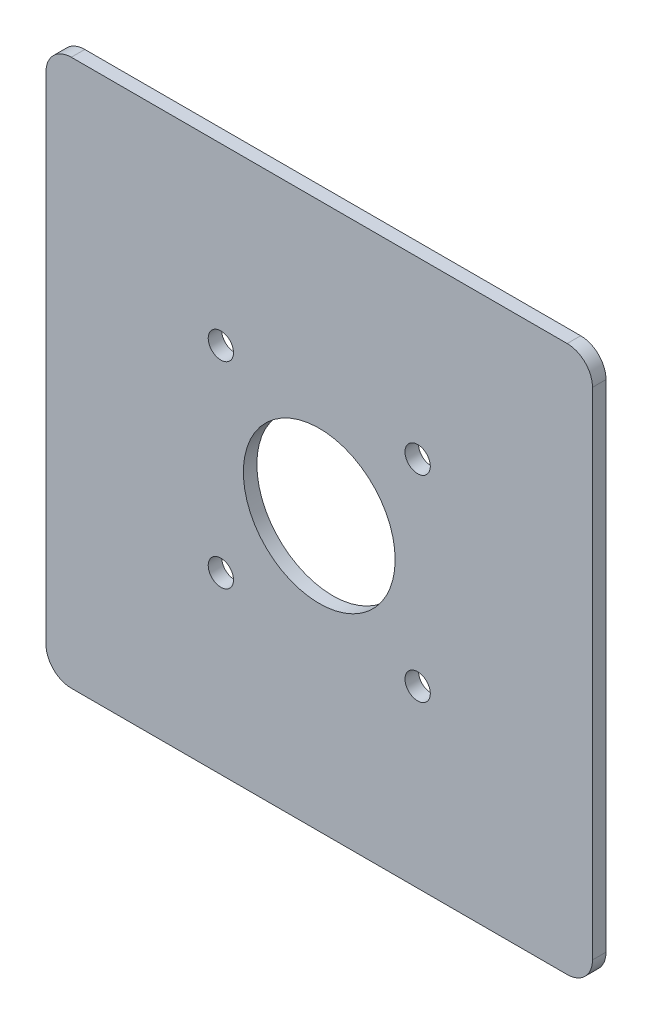
ISO-10303-21;
HEADER;
FILE_DESCRIPTION(('STEP AP214'),'2;1');
FILE_NAME('part.step','',(''),(''),'','','');
FILE_SCHEMA(('AUTOMOTIVE_DESIGN { 1 0 10303 214 1 1 1 1 }'));
ENDSEC;
DATA;
#1=APPLICATION_CONTEXT('core data for automotive mechanical design processes');
#2=APPLICATION_PROTOCOL_DEFINITION('international standard','automotive_design',2000,#1);
#3=PRODUCT_CONTEXT('',#1,'mechanical');
#4=PRODUCT('Part','Part','',(#3));
#5=PRODUCT_RELATED_PRODUCT_CATEGORY('part','',(#4));
#6=PRODUCT_DEFINITION_FORMATION('','',#4);
#7=PRODUCT_DEFINITION_CONTEXT('part definition',#1,'design');
#8=PRODUCT_DEFINITION('design','',#6,#7);
#9=PRODUCT_DEFINITION_SHAPE('','',#8);
#10=(LENGTH_UNIT() NAMED_UNIT(*) SI_UNIT(.MILLI.,.METRE.));
#11=(NAMED_UNIT(*) PLANE_ANGLE_UNIT() SI_UNIT($,.RADIAN.));
#12=(NAMED_UNIT(*) SI_UNIT($,.STERADIAN.) SOLID_ANGLE_UNIT());
#13=UNCERTAINTY_MEASURE_WITH_UNIT(LENGTH_MEASURE(1.E-05),#10,'distance_accuracy_value','');
#14=(GEOMETRIC_REPRESENTATION_CONTEXT(3) GLOBAL_UNCERTAINTY_ASSIGNED_CONTEXT((#13)) GLOBAL_UNIT_ASSIGNED_CONTEXT((#10,
#11,#12)) REPRESENTATION_CONTEXT('',''));
#15=CARTESIAN_POINT('',(0.,0.,0.));
#16=DIRECTION('',(0.,0.,1.));
#17=DIRECTION('',(1.,0.,0.));
#18=AXIS2_PLACEMENT_3D('',#15,#16,#17);
#19=CARTESIAN_POINT('',(162.,-162.,8.));
#20=DIRECTION('',(-1.,0.,0.));
#21=DIRECTION('',(0.,0.,1.));
#22=AXIS2_PLACEMENT_3D('',#19,#20,#21);
#23=PLANE('',#22);
#24=DIRECTION('',(0.,1.,0.));
#25=VECTOR('',#24,1.);
#26=CARTESIAN_POINT('',(162.,-162.,0.));
#27=LINE('',#26,#25);
#28=CARTESIAN_POINT('',(162.,-147.,0.));
#29=VERTEX_POINT('',#28);
#30=CARTESIAN_POINT('',(162.,147.,0.));
#31=VERTEX_POINT('',#30);
#32=EDGE_CURVE('E126',#29,#31,#27,.T.);
#33=ORIENTED_EDGE('',*,*,#32,.T.);
#34=DIRECTION('',(0.,0.,-1.));
#35=VECTOR('',#34,1.);
#36=CARTESIAN_POINT('',(162.,147.,8.));
#37=LINE('',#36,#35);
#38=CARTESIAN_POINT('',(162.,147.,8.));
#39=VERTEX_POINT('',#38);
#40=EDGE_CURVE('E104',#31,#39,#37,.F.);
#41=ORIENTED_EDGE('',*,*,#40,.T.);
#42=DIRECTION('',(0.,1.,0.));
#43=VECTOR('',#42,1.);
#44=CARTESIAN_POINT('',(162.,-162.,8.));
#45=LINE('',#44,#43);
#46=CARTESIAN_POINT('',(162.,-147.,8.));
#47=VERTEX_POINT('',#46);
#48=EDGE_CURVE('E136',#47,#39,#45,.T.);
#49=ORIENTED_EDGE('',*,*,#48,.F.);
#50=DIRECTION('',(0.,0.,-1.));
#51=VECTOR('',#50,1.);
#52=CARTESIAN_POINT('',(162.,-147.,8.));
#53=LINE('',#52,#51);
#54=EDGE_CURVE('E109',#47,#29,#53,.T.);
#55=ORIENTED_EDGE('',*,*,#54,.T.);
#56=EDGE_LOOP('',(#33,#41,#49,#55));
#57=FACE_BOUND('',#56,.T.);
#58=ADVANCED_FACE('F33',(#57),#23,.F.);
#59=CARTESIAN_POINT('',(-162.,162.,8.));
#60=DIRECTION('',(0.,-1.,0.));
#61=DIRECTION('',(0.,0.,-1.));
#62=AXIS2_PLACEMENT_3D('',#59,#60,#61);
#63=PLANE('',#62);
#64=DIRECTION('',(-1.,0.,0.));
#65=VECTOR('',#64,1.);
#66=CARTESIAN_POINT('',(-162.,162.,8.));
#67=LINE('',#66,#65);
#68=CARTESIAN_POINT('',(147.,162.,8.));
#69=VERTEX_POINT('',#68);
#70=CARTESIAN_POINT('',(-147.,162.,8.));
#71=VERTEX_POINT('',#70);
#72=EDGE_CURVE('E119',#69,#71,#67,.T.);
#73=ORIENTED_EDGE('',*,*,#72,.F.);
#74=DIRECTION('',(0.,0.,-1.));
#75=VECTOR('',#74,1.);
#76=CARTESIAN_POINT('',(147.,162.,8.));
#77=LINE('',#76,#75);
#78=CARTESIAN_POINT('',(147.,162.,0.));
#79=VERTEX_POINT('',#78);
#80=EDGE_CURVE('E103',#69,#79,#77,.T.);
#81=ORIENTED_EDGE('',*,*,#80,.T.);
#82=DIRECTION('',(-1.,0.,0.));
#83=VECTOR('',#82,1.);
#84=CARTESIAN_POINT('',(-162.,162.,0.));
#85=LINE('',#84,#83);
#86=CARTESIAN_POINT('',(-147.,162.,0.));
#87=VERTEX_POINT('',#86);
#88=EDGE_CURVE('E116',#79,#87,#85,.T.);
#89=ORIENTED_EDGE('',*,*,#88,.T.);
#90=DIRECTION('',(0.,0.,-1.));
#91=VECTOR('',#90,1.);
#92=CARTESIAN_POINT('',(-147.,162.,8.));
#93=LINE('',#92,#91);
#94=EDGE_CURVE('E121',#87,#71,#93,.F.);
#95=ORIENTED_EDGE('',*,*,#94,.T.);
#96=EDGE_LOOP('',(#73,#81,#89,#95));
#97=FACE_BOUND('',#96,.T.);
#98=ADVANCED_FACE('F115',(#97),#63,.F.);
#99=CARTESIAN_POINT('',(-162.,-162.,8.));
#100=DIRECTION('',(1.,0.,0.));
#101=DIRECTION('',(0.,0.,-1.));
#102=AXIS2_PLACEMENT_3D('',#99,#100,#101);
#103=PLANE('',#102);
#104=DIRECTION('',(0.,-1.,0.));
#105=VECTOR('',#104,1.);
#106=CARTESIAN_POINT('',(-162.,-162.,8.));
#107=LINE('',#106,#105);
#108=CARTESIAN_POINT('',(-162.,147.,8.));
#109=VERTEX_POINT('',#108);
#110=CARTESIAN_POINT('',(-162.,-147.,8.));
#111=VERTEX_POINT('',#110);
#112=EDGE_CURVE('E167',#109,#111,#107,.T.);
#113=ORIENTED_EDGE('',*,*,#112,.F.);
#114=DIRECTION('',(0.,0.,-1.));
#115=VECTOR('',#114,1.);
#116=CARTESIAN_POINT('',(-162.,147.,8.));
#117=LINE('',#116,#115);
#118=CARTESIAN_POINT('',(-162.,147.,0.));
#119=VERTEX_POINT('',#118);
#120=EDGE_CURVE('E160',#109,#119,#117,.T.);
#121=ORIENTED_EDGE('',*,*,#120,.T.);
#122=DIRECTION('',(0.,-1.,0.));
#123=VECTOR('',#122,1.);
#124=CARTESIAN_POINT('',(-162.,-162.,0.));
#125=LINE('',#124,#123);
#126=CARTESIAN_POINT('',(-162.,-147.,0.));
#127=VERTEX_POINT('',#126);
#128=EDGE_CURVE('E125',#119,#127,#125,.T.);
#129=ORIENTED_EDGE('',*,*,#128,.T.);
#130=DIRECTION('',(0.,0.,-1.));
#131=VECTOR('',#130,1.);
#132=CARTESIAN_POINT('',(-162.,-147.,8.));
#133=LINE('',#132,#131);
#134=EDGE_CURVE('E158',#127,#111,#133,.F.);
#135=ORIENTED_EDGE('',*,*,#134,.T.);
#136=EDGE_LOOP('',(#113,#121,#129,#135));
#137=FACE_BOUND('',#136,.T.);
#138=ADVANCED_FACE('F165',(#137),#103,.F.);
#139=CARTESIAN_POINT('',(-162.,-162.,8.));
#140=DIRECTION('',(0.,1.,0.));
#141=DIRECTION('',(0.,0.,1.));
#142=AXIS2_PLACEMENT_3D('',#139,#140,#141);
#143=PLANE('',#142);
#144=DIRECTION('',(1.,0.,0.));
#145=VECTOR('',#144,1.);
#146=CARTESIAN_POINT('',(-162.,-162.,8.));
#147=LINE('',#146,#145);
#148=CARTESIAN_POINT('',(-147.,-162.,8.));
#149=VERTEX_POINT('',#148);
#150=CARTESIAN_POINT('',(147.,-162.,8.));
#151=VERTEX_POINT('',#150);
#152=EDGE_CURVE('E142',#149,#151,#147,.T.);
#153=ORIENTED_EDGE('',*,*,#152,.F.);
#154=DIRECTION('',(0.,0.,-1.));
#155=VECTOR('',#154,1.);
#156=CARTESIAN_POINT('',(-147.,-162.,8.));
#157=LINE('',#156,#155);
#158=CARTESIAN_POINT('',(-147.,-162.,0.));
#159=VERTEX_POINT('',#158);
#160=EDGE_CURVE('E11',#149,#159,#157,.T.);
#161=ORIENTED_EDGE('',*,*,#160,.T.);
#162=DIRECTION('',(1.,0.,0.));
#163=VECTOR('',#162,1.);
#164=CARTESIAN_POINT('',(-162.,-162.,0.));
#165=LINE('',#164,#163);
#166=CARTESIAN_POINT('',(147.,-162.,0.));
#167=VERTEX_POINT('',#166);
#168=EDGE_CURVE('E129',#159,#167,#165,.T.);
#169=ORIENTED_EDGE('',*,*,#168,.T.);
#170=DIRECTION('',(0.,0.,-1.));
#171=VECTOR('',#170,1.);
#172=CARTESIAN_POINT('',(147.,-162.,8.));
#173=LINE('',#172,#171);
#174=EDGE_CURVE('E41',#167,#151,#173,.F.);
#175=ORIENTED_EDGE('',*,*,#174,.T.);
#176=EDGE_LOOP('',(#153,#161,#169,#175));
#177=FACE_BOUND('',#176,.T.);
#178=ADVANCED_FACE('F174',(#177),#143,.F.);
#179=CARTESIAN_POINT('',(0.,0.,8.));
#180=DIRECTION('',(0.,0.,-1.));
#181=DIRECTION('',(-1.,0.,0.));
#182=AXIS2_PLACEMENT_3D('',#179,#180,#181);
#183=PLANE('',#182);
#184=CARTESIAN_POINT('',(-58.3363094478904,58.33630944789,8.));
#185=DIRECTION('',(0.,0.,1.));
#186=DIRECTION('',(0.,1.,0.));
#187=AXIS2_PLACEMENT_3D('',#184,#185,#186);
#188=CIRCLE('',#187,7.5);
#189=CARTESIAN_POINT('',(-58.3363094478904,65.83630944789,8.));
#190=VERTEX_POINT('',#189);
#191=EDGE_CURVE('E200',#190,#190,#188,.T.);
#192=ORIENTED_EDGE('',*,*,#191,.F.);
#193=EDGE_LOOP('',(#192));
#194=FACE_BOUND('',#193,.T.);
#195=CARTESIAN_POINT('',(-58.3363094478902,-58.3363094478902,8.));
#196=DIRECTION('',(0.,0.,1.));
#197=DIRECTION('',(-1.,0.,0.));
#198=AXIS2_PLACEMENT_3D('',#195,#196,#197);
#199=CIRCLE('',#198,7.5);
#200=CARTESIAN_POINT('',(-65.8363094478901,-58.3363094478902,8.));
#201=VERTEX_POINT('',#200);
#202=EDGE_CURVE('E194',#201,#201,#199,.T.);
#203=ORIENTED_EDGE('',*,*,#202,.F.);
#204=EDGE_LOOP('',(#203));
#205=FACE_BOUND('',#204,.T.);
#206=CARTESIAN_POINT('',(58.3363094478908,-58.3363094478895,8.));
#207=DIRECTION('',(0.,0.,1.));
#208=DIRECTION('',(0.,-1.,0.));
#209=AXIS2_PLACEMENT_3D('',#206,#207,#208);
#210=CIRCLE('',#209,7.5);
#211=CARTESIAN_POINT('',(58.3363094478909,-65.8363094478895,8.));
#212=VERTEX_POINT('',#211);
#213=EDGE_CURVE('E188',#212,#212,#210,.T.);
#214=ORIENTED_EDGE('',*,*,#213,.F.);
#215=EDGE_LOOP('',(#214));
#216=FACE_BOUND('',#215,.T.);
#217=CARTESIAN_POINT('',(0.,0.,8.));
#218=DIRECTION('',(0.,0.,1.));
#219=DIRECTION('',(1.,0.,0.));
#220=AXIS2_PLACEMENT_3D('',#217,#218,#219);
#221=CIRCLE('',#220,45.);
#222=CARTESIAN_POINT('',(45.,0.,8.));
#223=VERTEX_POINT('',#222);
#224=EDGE_CURVE('E141',#223,#223,#221,.T.);
#225=ORIENTED_EDGE('',*,*,#224,.F.);
#226=EDGE_LOOP('',(#225));
#227=FACE_BOUND('',#226,.T.);
#228=CARTESIAN_POINT('',(58.3363094478902,58.3363094478902,8.));
#229=DIRECTION('',(0.,0.,1.));
#230=DIRECTION('',(1.,0.,0.));
#231=AXIS2_PLACEMENT_3D('',#228,#229,#230);
#232=CIRCLE('',#231,7.5);
#233=CARTESIAN_POINT('',(65.8363094478901,58.3363094478902,8.));
#234=VERTEX_POINT('',#233);
#235=EDGE_CURVE('E140',#234,#234,#232,.T.);
#236=ORIENTED_EDGE('',*,*,#235,.F.);
#237=EDGE_LOOP('',(#236));
#238=FACE_BOUND('',#237,.T.);
#239=ORIENTED_EDGE('',*,*,#48,.T.);
#240=CARTESIAN_POINT('',(147.,147.,8.));
#241=DIRECTION('',(0.,0.,-1.));
#242=DIRECTION('',(-1.,0.,0.));
#243=AXIS2_PLACEMENT_3D('',#240,#241,#242);
#244=CIRCLE('',#243,15.);
#245=EDGE_CURVE('E156',#39,#69,#244,.F.);
#246=ORIENTED_EDGE('',*,*,#245,.T.);
#247=ORIENTED_EDGE('',*,*,#72,.T.);
#248=CARTESIAN_POINT('',(-147.,147.,8.));
#249=DIRECTION('',(0.,0.,-1.));
#250=DIRECTION('',(-1.,0.,0.));
#251=AXIS2_PLACEMENT_3D('',#248,#249,#250);
#252=CIRCLE('',#251,15.);
#253=EDGE_CURVE('E154',#71,#109,#252,.F.);
#254=ORIENTED_EDGE('',*,*,#253,.T.);
#255=ORIENTED_EDGE('',*,*,#112,.T.);
#256=CARTESIAN_POINT('',(-147.,-147.,8.));
#257=DIRECTION('',(0.,0.,-1.));
#258=DIRECTION('',(-1.,0.,0.));
#259=AXIS2_PLACEMENT_3D('',#256,#257,#258);
#260=CIRCLE('',#259,15.);
#261=EDGE_CURVE('E54',#111,#149,#260,.F.);
#262=ORIENTED_EDGE('',*,*,#261,.T.);
#263=ORIENTED_EDGE('',*,*,#152,.T.);
#264=CARTESIAN_POINT('',(147.,-147.,8.));
#265=DIRECTION('',(0.,0.,-1.));
#266=DIRECTION('',(-1.,0.,0.));
#267=AXIS2_PLACEMENT_3D('',#264,#265,#266);
#268=CIRCLE('',#267,15.);
#269=EDGE_CURVE('E151',#151,#47,#268,.F.);
#270=ORIENTED_EDGE('',*,*,#269,.T.);
#271=EDGE_LOOP('',(#239,#246,#247,#254,#255,#262,#263,#270));
#272=FACE_BOUND('',#271,.T.);
#273=ADVANCED_FACE('F215',(#194,#205,#216,#227,#238,#272),#183,.F.);
#274=CARTESIAN_POINT('',(0.,0.,0.));
#275=DIRECTION('',(0.,0.,-1.));
#276=DIRECTION('',(-1.,0.,0.));
#277=AXIS2_PLACEMENT_3D('',#274,#275,#276);
#278=PLANE('',#277);
#279=CARTESIAN_POINT('',(-58.3363094478904,58.33630944789,0.));
#280=DIRECTION('',(0.,0.,1.));
#281=DIRECTION('',(0.,1.,0.));
#282=AXIS2_PLACEMENT_3D('',#279,#280,#281);
#283=CIRCLE('',#282,7.5);
#284=CARTESIAN_POINT('',(-58.3363094478904,65.83630944789,0.));
#285=VERTEX_POINT('',#284);
#286=EDGE_CURVE('E187',#285,#285,#283,.T.);
#287=ORIENTED_EDGE('',*,*,#286,.T.);
#288=EDGE_LOOP('',(#287));
#289=FACE_BOUND('',#288,.T.);
#290=CARTESIAN_POINT('',(-58.3363094478902,-58.3363094478902,0.));
#291=DIRECTION('',(0.,0.,1.));
#292=DIRECTION('',(-1.,0.,0.));
#293=AXIS2_PLACEMENT_3D('',#290,#291,#292);
#294=CIRCLE('',#293,7.5);
#295=CARTESIAN_POINT('',(-65.8363094478901,-58.3363094478902,0.));
#296=VERTEX_POINT('',#295);
#297=EDGE_CURVE('E197',#296,#296,#294,.T.);
#298=ORIENTED_EDGE('',*,*,#297,.T.);
#299=EDGE_LOOP('',(#298));
#300=FACE_BOUND('',#299,.T.);
#301=CARTESIAN_POINT('',(58.3363094478908,-58.3363094478895,0.));
#302=DIRECTION('',(0.,0.,1.));
#303=DIRECTION('',(0.,-1.,0.));
#304=AXIS2_PLACEMENT_3D('',#301,#302,#303);
#305=CIRCLE('',#304,7.5);
#306=CARTESIAN_POINT('',(58.3363094478909,-65.8363094478895,0.));
#307=VERTEX_POINT('',#306);
#308=EDGE_CURVE('E191',#307,#307,#305,.T.);
#309=ORIENTED_EDGE('',*,*,#308,.T.);
#310=EDGE_LOOP('',(#309));
#311=FACE_BOUND('',#310,.T.);
#312=CARTESIAN_POINT('',(0.,0.,0.));
#313=DIRECTION('',(0.,0.,-1.));
#314=DIRECTION('',(-1.,0.,0.));
#315=AXIS2_PLACEMENT_3D('',#312,#313,#314);
#316=CIRCLE('',#315,45.);
#317=CARTESIAN_POINT('',(-45.,0.,0.));
#318=VERTEX_POINT('',#317);
#319=EDGE_CURVE('E137',#318,#318,#316,.T.);
#320=ORIENTED_EDGE('',*,*,#319,.F.);
#321=EDGE_LOOP('',(#320));
#322=FACE_BOUND('',#321,.T.);
#323=CARTESIAN_POINT('',(58.3363094478902,58.3363094478902,0.));
#324=DIRECTION('',(0.,0.,1.));
#325=DIRECTION('',(1.,0.,0.));
#326=AXIS2_PLACEMENT_3D('',#323,#324,#325);
#327=CIRCLE('',#326,7.5);
#328=CARTESIAN_POINT('',(65.8363094478901,58.3363094478902,0.));
#329=VERTEX_POINT('',#328);
#330=EDGE_CURVE('E131',#329,#329,#327,.T.);
#331=ORIENTED_EDGE('',*,*,#330,.T.);
#332=EDGE_LOOP('',(#331));
#333=FACE_BOUND('',#332,.T.);
#334=ORIENTED_EDGE('',*,*,#88,.F.);
#335=CARTESIAN_POINT('',(147.,147.,0.));
#336=DIRECTION('',(0.,0.,-1.));
#337=DIRECTION('',(-1.,0.,0.));
#338=AXIS2_PLACEMENT_3D('',#335,#336,#337);
#339=CIRCLE('',#338,15.);
#340=EDGE_CURVE('E99',#79,#31,#339,.T.);
#341=ORIENTED_EDGE('',*,*,#340,.T.);
#342=ORIENTED_EDGE('',*,*,#32,.F.);
#343=CARTESIAN_POINT('',(147.,-147.,0.));
#344=DIRECTION('',(0.,0.,-1.));
#345=DIRECTION('',(-1.,0.,0.));
#346=AXIS2_PLACEMENT_3D('',#343,#344,#345);
#347=CIRCLE('',#346,15.);
#348=EDGE_CURVE('E120',#29,#167,#347,.T.);
#349=ORIENTED_EDGE('',*,*,#348,.T.);
#350=ORIENTED_EDGE('',*,*,#168,.F.);
#351=CARTESIAN_POINT('',(-147.,-147.,0.));
#352=DIRECTION('',(0.,0.,-1.));
#353=DIRECTION('',(-1.,0.,0.));
#354=AXIS2_PLACEMENT_3D('',#351,#352,#353);
#355=CIRCLE('',#354,15.);
#356=EDGE_CURVE('E145',#159,#127,#355,.T.);
#357=ORIENTED_EDGE('',*,*,#356,.T.);
#358=ORIENTED_EDGE('',*,*,#128,.F.);
#359=CARTESIAN_POINT('',(-147.,147.,0.));
#360=DIRECTION('',(0.,0.,-1.));
#361=DIRECTION('',(-1.,0.,0.));
#362=AXIS2_PLACEMENT_3D('',#359,#360,#361);
#363=CIRCLE('',#362,15.);
#364=EDGE_CURVE('E110',#119,#87,#363,.T.);
#365=ORIENTED_EDGE('',*,*,#364,.T.);
#366=EDGE_LOOP('',(#334,#341,#342,#349,#350,#357,#358,#365));
#367=FACE_BOUND('',#366,.T.);
#368=ADVANCED_FACE('F123',(#289,#300,#311,#322,#333,#367),#278,.T.);
#369=CARTESIAN_POINT('',(58.3363094478902,58.3363094478902,0.));
#370=DIRECTION('',(0.,0.,1.));
#371=DIRECTION('',(1.,0.,0.));
#372=AXIS2_PLACEMENT_3D('',#369,#370,#371);
#373=CYLINDRICAL_SURFACE('',#372,7.5);
#374=ORIENTED_EDGE('',*,*,#330,.F.);
#375=EDGE_LOOP('',(#374));
#376=FACE_BOUND('',#375,.T.);
#377=ORIENTED_EDGE('',*,*,#235,.T.);
#378=EDGE_LOOP('',(#377));
#379=FACE_BOUND('',#378,.T.);
#380=ADVANCED_FACE('F298',(#376,#379),#373,.F.);
#381=CARTESIAN_POINT('',(0.,0.,-2.));
#382=DIRECTION('',(0.,0.,1.));
#383=DIRECTION('',(1.,0.,0.));
#384=AXIS2_PLACEMENT_3D('',#381,#382,#383);
#385=CYLINDRICAL_SURFACE('',#384,45.);
#386=ORIENTED_EDGE('',*,*,#319,.T.);
#387=EDGE_LOOP('',(#386));
#388=FACE_BOUND('',#387,.T.);
#389=ORIENTED_EDGE('',*,*,#224,.T.);
#390=EDGE_LOOP('',(#389));
#391=FACE_BOUND('',#390,.T.);
#392=ADVANCED_FACE('F289',(#388,#391),#385,.F.);
#393=CARTESIAN_POINT('',(58.3363094478908,-58.3363094478895,0.));
#394=DIRECTION('',(0.,0.,1.));
#395=DIRECTION('',(1.,0.,0.));
#396=AXIS2_PLACEMENT_3D('',#393,#394,#395);
#397=CYLINDRICAL_SURFACE('',#396,7.5);
#398=ORIENTED_EDGE('',*,*,#308,.F.);
#399=EDGE_LOOP('',(#398));
#400=FACE_BOUND('',#399,.T.);
#401=ORIENTED_EDGE('',*,*,#213,.T.);
#402=EDGE_LOOP('',(#401));
#403=FACE_BOUND('',#402,.T.);
#404=ADVANCED_FACE('F280',(#400,#403),#397,.F.);
#405=CARTESIAN_POINT('',(-58.3363094478902,-58.3363094478902,0.));
#406=DIRECTION('',(0.,0.,1.));
#407=DIRECTION('',(1.,0.,0.));
#408=AXIS2_PLACEMENT_3D('',#405,#406,#407);
#409=CYLINDRICAL_SURFACE('',#408,7.5);
#410=ORIENTED_EDGE('',*,*,#297,.F.);
#411=EDGE_LOOP('',(#410));
#412=FACE_BOUND('',#411,.T.);
#413=ORIENTED_EDGE('',*,*,#202,.T.);
#414=EDGE_LOOP('',(#413));
#415=FACE_BOUND('',#414,.T.);
#416=ADVANCED_FACE('F211',(#412,#415),#409,.F.);
#417=CARTESIAN_POINT('',(-58.3363094478904,58.33630944789,0.));
#418=DIRECTION('',(0.,0.,1.));
#419=DIRECTION('',(1.,0.,0.));
#420=AXIS2_PLACEMENT_3D('',#417,#418,#419);
#421=CYLINDRICAL_SURFACE('',#420,7.5);
#422=ORIENTED_EDGE('',*,*,#286,.F.);
#423=EDGE_LOOP('',(#422));
#424=FACE_BOUND('',#423,.T.);
#425=ORIENTED_EDGE('',*,*,#191,.T.);
#426=EDGE_LOOP('',(#425));
#427=FACE_BOUND('',#426,.T.);
#428=ADVANCED_FACE('F208',(#424,#427),#421,.F.);
#429=CARTESIAN_POINT('',(147.,147.,8.));
#430=DIRECTION('',(0.,0.,-1.));
#431=DIRECTION('',(-1.,0.,0.));
#432=AXIS2_PLACEMENT_3D('',#429,#430,#431);
#433=CYLINDRICAL_SURFACE('',#432,15.);
#434=ORIENTED_EDGE('',*,*,#245,.F.);
#435=ORIENTED_EDGE('',*,*,#40,.F.);
#436=ORIENTED_EDGE('',*,*,#340,.F.);
#437=ORIENTED_EDGE('',*,*,#80,.F.);
#438=EDGE_LOOP('',(#434,#435,#436,#437));
#439=FACE_BOUND('',#438,.T.);
#440=ADVANCED_FACE('F102',(#439),#433,.T.);
#441=CARTESIAN_POINT('',(-147.,147.,8.));
#442=DIRECTION('',(0.,0.,-1.));
#443=DIRECTION('',(-1.,0.,0.));
#444=AXIS2_PLACEMENT_3D('',#441,#442,#443);
#445=CYLINDRICAL_SURFACE('',#444,15.);
#446=ORIENTED_EDGE('',*,*,#253,.F.);
#447=ORIENTED_EDGE('',*,*,#94,.F.);
#448=ORIENTED_EDGE('',*,*,#364,.F.);
#449=ORIENTED_EDGE('',*,*,#120,.F.);
#450=EDGE_LOOP('',(#446,#447,#448,#449));
#451=FACE_BOUND('',#450,.T.);
#452=ADVANCED_FACE('F234',(#451),#445,.T.);
#453=CARTESIAN_POINT('',(-147.,-147.,8.));
#454=DIRECTION('',(0.,0.,-1.));
#455=DIRECTION('',(-1.,0.,0.));
#456=AXIS2_PLACEMENT_3D('',#453,#454,#455);
#457=CYLINDRICAL_SURFACE('',#456,15.);
#458=ORIENTED_EDGE('',*,*,#261,.F.);
#459=ORIENTED_EDGE('',*,*,#134,.F.);
#460=ORIENTED_EDGE('',*,*,#356,.F.);
#461=ORIENTED_EDGE('',*,*,#160,.F.);
#462=EDGE_LOOP('',(#458,#459,#460,#461));
#463=FACE_BOUND('',#462,.T.);
#464=ADVANCED_FACE('F173',(#463),#457,.T.);
#465=CARTESIAN_POINT('',(147.,-147.,8.));
#466=DIRECTION('',(0.,0.,-1.));
#467=DIRECTION('',(-1.,0.,0.));
#468=AXIS2_PLACEMENT_3D('',#465,#466,#467);
#469=CYLINDRICAL_SURFACE('',#468,15.);
#470=ORIENTED_EDGE('',*,*,#269,.F.);
#471=ORIENTED_EDGE('',*,*,#174,.F.);
#472=ORIENTED_EDGE('',*,*,#348,.F.);
#473=ORIENTED_EDGE('',*,*,#54,.F.);
#474=EDGE_LOOP('',(#470,#471,#472,#473));
#475=FACE_BOUND('',#474,.T.);
#476=ADVANCED_FACE('F35',(#475),#469,.T.);
#477=CLOSED_SHELL('',(#58,#98,#138,#178,#273,#368,#380,#392,#404,#416,#428,#440,#452,#464,#476));
#478=MANIFOLD_SOLID_BREP('B2',#477);
#479=ADVANCED_BREP_SHAPE_REPRESENTATION('',(#18,#478),#14);
#480=SHAPE_DEFINITION_REPRESENTATION(#9,#479);
ENDSEC;
END-ISO-10303-21;
